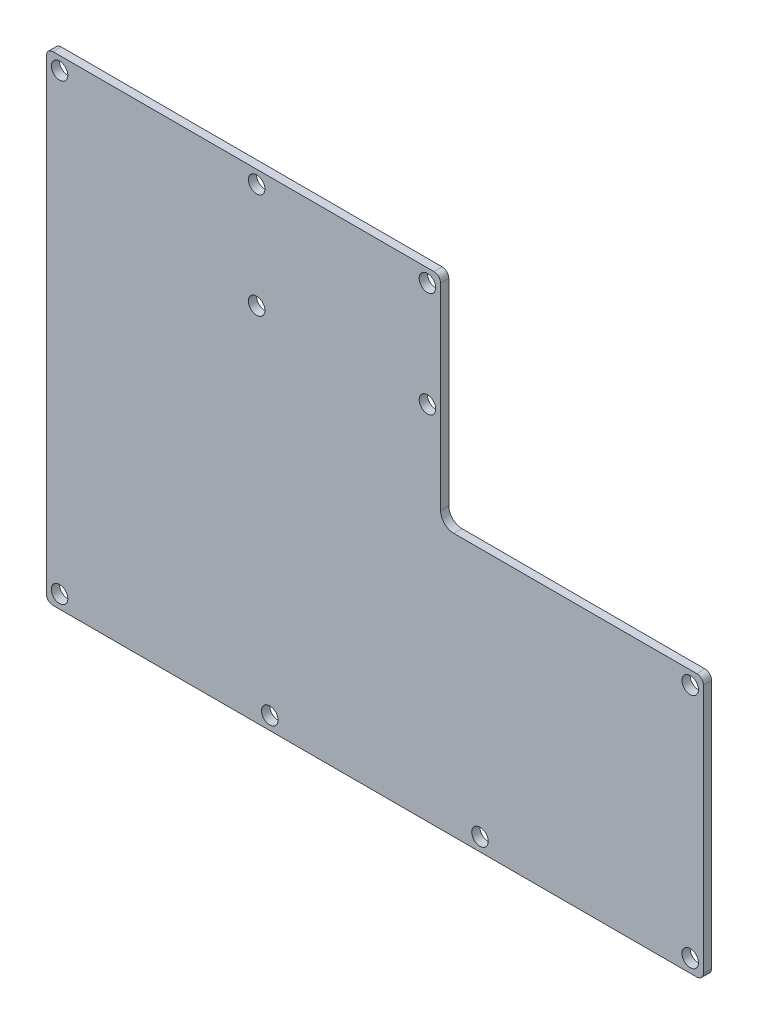
ISO-10303-21;
HEADER;
FILE_DESCRIPTION(('STEP AP214'),'2;1');
FILE_NAME('part.step','',(''),(''),'','','');
FILE_SCHEMA(('AUTOMOTIVE_DESIGN { 1 0 10303 214 1 1 1 1 }'));
ENDSEC;
DATA;
#1=APPLICATION_CONTEXT('core data for automotive mechanical design processes');
#2=APPLICATION_PROTOCOL_DEFINITION('international standard','automotive_design',2000,#1);
#3=PRODUCT_CONTEXT('',#1,'mechanical');
#4=PRODUCT('Part','Part','',(#3));
#5=PRODUCT_RELATED_PRODUCT_CATEGORY('part','',(#4));
#6=PRODUCT_DEFINITION_FORMATION('','',#4);
#7=PRODUCT_DEFINITION_CONTEXT('part definition',#1,'design');
#8=PRODUCT_DEFINITION('design','',#6,#7);
#9=PRODUCT_DEFINITION_SHAPE('','',#8);
#10=(LENGTH_UNIT() NAMED_UNIT(*) SI_UNIT(.MILLI.,.METRE.));
#11=(NAMED_UNIT(*) PLANE_ANGLE_UNIT() SI_UNIT($,.RADIAN.));
#12=(NAMED_UNIT(*) SI_UNIT($,.STERADIAN.) SOLID_ANGLE_UNIT());
#13=UNCERTAINTY_MEASURE_WITH_UNIT(LENGTH_MEASURE(1.E-05),#10,'distance_accuracy_value','');
#14=(GEOMETRIC_REPRESENTATION_CONTEXT(3) GLOBAL_UNCERTAINTY_ASSIGNED_CONTEXT((#13)) GLOBAL_UNIT_ASSIGNED_CONTEXT((#10,
#11,#12)) REPRESENTATION_CONTEXT('',''));
#15=CARTESIAN_POINT('',(0.,0.,0.));
#16=DIRECTION('',(0.,0.,1.));
#17=DIRECTION('',(1.,0.,0.));
#18=AXIS2_PLACEMENT_3D('',#15,#16,#17);
#19=CARTESIAN_POINT('',(125.73,1.27,-1.5875));
#20=DIRECTION('',(0.,0.,1.));
#21=DIRECTION('',(1.,0.,0.));
#22=AXIS2_PLACEMENT_3D('',#19,#20,#21);
#23=CYLINDRICAL_SURFACE('',#22,1.27);
#24=CARTESIAN_POINT('',(125.73,1.27,0.));
#25=DIRECTION('',(0.,0.,1.));
#26=DIRECTION('',(1.,0.,0.));
#27=AXIS2_PLACEMENT_3D('',#24,#25,#26);
#28=CIRCLE('',#27,1.27);
#29=CARTESIAN_POINT('',(125.73,0.,0.));
#30=VERTEX_POINT('',#29);
#31=CARTESIAN_POINT('',(127.,1.27,0.));
#32=VERTEX_POINT('',#31);
#33=EDGE_CURVE('E160',#30,#32,#28,.T.);
#34=ORIENTED_EDGE('',*,*,#33,.F.);
#35=DIRECTION('',(0.,0.,1.));
#36=VECTOR('',#35,1.);
#37=CARTESIAN_POINT('',(125.73,0.,-1.5875));
#38=LINE('',#37,#36);
#39=CARTESIAN_POINT('',(125.73,0.,-1.5875));
#40=VERTEX_POINT('',#39);
#41=EDGE_CURVE('E11',#40,#30,#38,.T.);
#42=ORIENTED_EDGE('',*,*,#41,.F.);
#43=CARTESIAN_POINT('',(125.73,1.27,-1.5875));
#44=DIRECTION('',(0.,0.,1.));
#45=DIRECTION('',(1.,0.,0.));
#46=AXIS2_PLACEMENT_3D('',#43,#44,#45);
#47=CIRCLE('',#46,1.27);
#48=CARTESIAN_POINT('',(127.,1.27,-1.5875));
#49=VERTEX_POINT('',#48);
#50=EDGE_CURVE('E193',#40,#49,#47,.T.);
#51=ORIENTED_EDGE('',*,*,#50,.T.);
#52=DIRECTION('',(0.,0.,1.));
#53=VECTOR('',#52,1.);
#54=CARTESIAN_POINT('',(127.,1.27,-1.5875));
#55=LINE('',#54,#53);
#56=EDGE_CURVE('E42',#49,#32,#55,.T.);
#57=ORIENTED_EDGE('',*,*,#56,.T.);
#58=EDGE_LOOP('',(#34,#42,#51,#57));
#59=FACE_BOUND('',#58,.T.);
#60=ADVANCED_FACE('F39',(#59),#23,.T.);
#61=CARTESIAN_POINT('',(1.27,0.,-1.5875));
#62=DIRECTION('',(0.,-1.,0.));
#63=DIRECTION('',(0.,0.,-1.));
#64=AXIS2_PLACEMENT_3D('',#61,#62,#63);
#65=PLANE('',#64);
#66=DIRECTION('',(1.,0.,0.));
#67=VECTOR('',#66,1.);
#68=CARTESIAN_POINT('',(1.27,0.,0.));
#69=LINE('',#68,#67);
#70=CARTESIAN_POINT('',(1.27,0.,0.));
#71=VERTEX_POINT('',#70);
#72=EDGE_CURVE('E191',#71,#30,#69,.T.);
#73=ORIENTED_EDGE('',*,*,#72,.F.);
#74=DIRECTION('',(0.,0.,1.));
#75=VECTOR('',#74,1.);
#76=CARTESIAN_POINT('',(1.27,0.,-1.5875));
#77=LINE('',#76,#75);
#78=CARTESIAN_POINT('',(1.27,0.,-1.5875));
#79=VERTEX_POINT('',#78);
#80=EDGE_CURVE('E48',#79,#71,#77,.T.);
#81=ORIENTED_EDGE('',*,*,#80,.F.);
#82=DIRECTION('',(1.,0.,0.));
#83=VECTOR('',#82,1.);
#84=CARTESIAN_POINT('',(1.27,0.,-1.5875));
#85=LINE('',#84,#83);
#86=EDGE_CURVE('E150',#79,#40,#85,.T.);
#87=ORIENTED_EDGE('',*,*,#86,.T.);
#88=ORIENTED_EDGE('',*,*,#41,.T.);
#89=EDGE_LOOP('',(#73,#81,#87,#88));
#90=FACE_BOUND('',#89,.T.);
#91=ADVANCED_FACE('F213',(#90),#65,.T.);
#92=CARTESIAN_POINT('',(1.27,1.27,-1.5875));
#93=DIRECTION('',(0.,0.,1.));
#94=DIRECTION('',(1.,0.,0.));
#95=AXIS2_PLACEMENT_3D('',#92,#93,#94);
#96=CYLINDRICAL_SURFACE('',#95,1.27);
#97=CARTESIAN_POINT('',(1.27,1.27,0.));
#98=DIRECTION('',(0.,0.,1.));
#99=DIRECTION('',(1.,0.,0.));
#100=AXIS2_PLACEMENT_3D('',#97,#98,#99);
#101=CIRCLE('',#100,1.27);
#102=CARTESIAN_POINT('',(0.,1.27,0.));
#103=VERTEX_POINT('',#102);
#104=EDGE_CURVE('E137',#103,#71,#101,.T.);
#105=ORIENTED_EDGE('',*,*,#104,.F.);
#106=DIRECTION('',(0.,0.,1.));
#107=VECTOR('',#106,1.);
#108=CARTESIAN_POINT('',(0.,1.27,-1.5875));
#109=LINE('',#108,#107);
#110=CARTESIAN_POINT('',(0.,1.27,-1.5875));
#111=VERTEX_POINT('',#110);
#112=EDGE_CURVE('E132',#111,#103,#109,.T.);
#113=ORIENTED_EDGE('',*,*,#112,.F.);
#114=CARTESIAN_POINT('',(1.27,1.27,-1.5875));
#115=DIRECTION('',(0.,0.,1.));
#116=DIRECTION('',(1.,0.,0.));
#117=AXIS2_PLACEMENT_3D('',#114,#115,#116);
#118=CIRCLE('',#117,1.27);
#119=EDGE_CURVE('E135',#111,#79,#118,.T.);
#120=ORIENTED_EDGE('',*,*,#119,.T.);
#121=ORIENTED_EDGE('',*,*,#80,.T.);
#122=EDGE_LOOP('',(#105,#113,#120,#121));
#123=FACE_BOUND('',#122,.T.);
#124=ADVANCED_FACE('F134',(#123),#96,.T.);
#125=CARTESIAN_POINT('',(0.,91.44,-1.5875));
#126=DIRECTION('',(-1.,0.,0.));
#127=DIRECTION('',(0.,0.,1.));
#128=AXIS2_PLACEMENT_3D('',#125,#126,#127);
#129=PLANE('',#128);
#130=DIRECTION('',(0.,-1.,0.));
#131=VECTOR('',#130,1.);
#132=CARTESIAN_POINT('',(0.,91.44,0.));
#133=LINE('',#132,#131);
#134=CARTESIAN_POINT('',(0.,91.44,0.));
#135=VERTEX_POINT('',#134);
#136=EDGE_CURVE('E188',#135,#103,#133,.T.);
#137=ORIENTED_EDGE('',*,*,#136,.F.);
#138=DIRECTION('',(0.,0.,1.));
#139=VECTOR('',#138,1.);
#140=CARTESIAN_POINT('',(0.,91.44,-1.5875));
#141=LINE('',#140,#139);
#142=CARTESIAN_POINT('',(0.,91.44,-1.5875));
#143=VERTEX_POINT('',#142);
#144=EDGE_CURVE('E142',#143,#135,#141,.T.);
#145=ORIENTED_EDGE('',*,*,#144,.F.);
#146=DIRECTION('',(0.,-1.,0.));
#147=VECTOR('',#146,1.);
#148=CARTESIAN_POINT('',(0.,91.44,-1.5875));
#149=LINE('',#148,#147);
#150=EDGE_CURVE('E148',#143,#111,#149,.T.);
#151=ORIENTED_EDGE('',*,*,#150,.T.);
#152=ORIENTED_EDGE('',*,*,#112,.T.);
#153=EDGE_LOOP('',(#137,#145,#151,#152));
#154=FACE_BOUND('',#153,.T.);
#155=ADVANCED_FACE('F152',(#154),#129,.T.);
#156=CARTESIAN_POINT('',(1.27,91.44,-1.5875));
#157=DIRECTION('',(0.,0.,1.));
#158=DIRECTION('',(1.,0.,0.));
#159=AXIS2_PLACEMENT_3D('',#156,#157,#158);
#160=CYLINDRICAL_SURFACE('',#159,1.27);
#161=CARTESIAN_POINT('',(1.27,91.44,0.));
#162=DIRECTION('',(0.,0.,1.));
#163=DIRECTION('',(1.,0.,0.));
#164=AXIS2_PLACEMENT_3D('',#161,#162,#163);
#165=CIRCLE('',#164,1.27);
#166=CARTESIAN_POINT('',(1.27,92.71,0.));
#167=VERTEX_POINT('',#166);
#168=EDGE_CURVE('E185',#167,#135,#165,.T.);
#169=ORIENTED_EDGE('',*,*,#168,.F.);
#170=DIRECTION('',(0.,0.,1.));
#171=VECTOR('',#170,1.);
#172=CARTESIAN_POINT('',(1.27,92.71,-1.5875));
#173=LINE('',#172,#171);
#174=CARTESIAN_POINT('',(1.27,92.71,-1.5875));
#175=VERTEX_POINT('',#174);
#176=EDGE_CURVE('E197',#175,#167,#173,.T.);
#177=ORIENTED_EDGE('',*,*,#176,.F.);
#178=CARTESIAN_POINT('',(1.27,91.44,-1.5875));
#179=DIRECTION('',(0.,0.,1.));
#180=DIRECTION('',(1.,0.,0.));
#181=AXIS2_PLACEMENT_3D('',#178,#179,#180);
#182=CIRCLE('',#181,1.27);
#183=EDGE_CURVE('E153',#175,#143,#182,.T.);
#184=ORIENTED_EDGE('',*,*,#183,.T.);
#185=ORIENTED_EDGE('',*,*,#144,.T.);
#186=EDGE_LOOP('',(#169,#177,#184,#185));
#187=FACE_BOUND('',#186,.T.);
#188=ADVANCED_FACE('F226',(#187),#160,.T.);
#189=CARTESIAN_POINT('',(1.27,92.71,-1.5875));
#190=DIRECTION('',(0.,1.,0.));
#191=DIRECTION('',(0.,0.,1.));
#192=AXIS2_PLACEMENT_3D('',#189,#190,#191);
#193=PLANE('',#192);
#194=DIRECTION('',(-1.,0.,0.));
#195=VECTOR('',#194,1.);
#196=CARTESIAN_POINT('',(1.27,92.71,0.));
#197=LINE('',#196,#195);
#198=CARTESIAN_POINT('',(74.93,92.71,0.));
#199=VERTEX_POINT('',#198);
#200=EDGE_CURVE('E182',#199,#167,#197,.T.);
#201=ORIENTED_EDGE('',*,*,#200,.F.);
#202=DIRECTION('',(0.,0.,1.));
#203=VECTOR('',#202,1.);
#204=CARTESIAN_POINT('',(74.93,92.71,-1.5875));
#205=LINE('',#204,#203);
#206=CARTESIAN_POINT('',(74.93,92.71,-1.5875));
#207=VERTEX_POINT('',#206);
#208=EDGE_CURVE('E199',#207,#199,#205,.T.);
#209=ORIENTED_EDGE('',*,*,#208,.F.);
#210=DIRECTION('',(-1.,0.,0.));
#211=VECTOR('',#210,1.);
#212=CARTESIAN_POINT('',(1.27,92.71,-1.5875));
#213=LINE('',#212,#211);
#214=EDGE_CURVE('E155',#207,#175,#213,.T.);
#215=ORIENTED_EDGE('',*,*,#214,.T.);
#216=ORIENTED_EDGE('',*,*,#176,.T.);
#217=EDGE_LOOP('',(#201,#209,#215,#216));
#218=FACE_BOUND('',#217,.T.);
#219=ADVANCED_FACE('F229',(#218),#193,.T.);
#220=CARTESIAN_POINT('',(74.93,91.44,-1.5875));
#221=DIRECTION('',(0.,0.,1.));
#222=DIRECTION('',(1.,0.,0.));
#223=AXIS2_PLACEMENT_3D('',#220,#221,#222);
#224=CYLINDRICAL_SURFACE('',#223,1.27);
#225=CARTESIAN_POINT('',(74.93,91.44,0.));
#226=DIRECTION('',(0.,0.,1.));
#227=DIRECTION('',(1.,0.,0.));
#228=AXIS2_PLACEMENT_3D('',#225,#226,#227);
#229=CIRCLE('',#228,1.27);
#230=CARTESIAN_POINT('',(76.2,91.44,0.));
#231=VERTEX_POINT('',#230);
#232=EDGE_CURVE('E179',#231,#199,#229,.T.);
#233=ORIENTED_EDGE('',*,*,#232,.F.);
#234=DIRECTION('',(0.,0.,1.));
#235=VECTOR('',#234,1.);
#236=CARTESIAN_POINT('',(76.2,91.44,-1.5875));
#237=LINE('',#236,#235);
#238=CARTESIAN_POINT('',(76.2,91.44,-1.5875));
#239=VERTEX_POINT('',#238);
#240=EDGE_CURVE('E201',#239,#231,#237,.T.);
#241=ORIENTED_EDGE('',*,*,#240,.F.);
#242=CARTESIAN_POINT('',(74.93,91.44,-1.5875));
#243=DIRECTION('',(0.,0.,1.));
#244=DIRECTION('',(1.,0.,0.));
#245=AXIS2_PLACEMENT_3D('',#242,#243,#244);
#246=CIRCLE('',#245,1.27);
#247=EDGE_CURVE('E383',#239,#207,#246,.T.);
#248=ORIENTED_EDGE('',*,*,#247,.T.);
#249=ORIENTED_EDGE('',*,*,#208,.T.);
#250=EDGE_LOOP('',(#233,#241,#248,#249));
#251=FACE_BOUND('',#250,.T.);
#252=ADVANCED_FACE('F233',(#251),#224,.T.);
#253=CARTESIAN_POINT('',(76.2,91.44,-1.5875));
#254=DIRECTION('',(1.,0.,0.));
#255=DIRECTION('',(0.,0.,-1.));
#256=AXIS2_PLACEMENT_3D('',#253,#254,#255);
#257=PLANE('',#256);
#258=DIRECTION('',(0.,1.,0.));
#259=VECTOR('',#258,1.);
#260=CARTESIAN_POINT('',(76.2,91.44,0.));
#261=LINE('',#260,#259);
#262=CARTESIAN_POINT('',(76.2,53.34,0.));
#263=VERTEX_POINT('',#262);
#264=EDGE_CURVE('E176',#263,#231,#261,.T.);
#265=ORIENTED_EDGE('',*,*,#264,.F.);
#266=DIRECTION('',(0.,0.,1.));
#267=VECTOR('',#266,1.);
#268=CARTESIAN_POINT('',(76.2,53.34,-1.5875));
#269=LINE('',#268,#267);
#270=CARTESIAN_POINT('',(76.2,53.34,-1.5875));
#271=VERTEX_POINT('',#270);
#272=EDGE_CURVE('E203',#271,#263,#269,.T.);
#273=ORIENTED_EDGE('',*,*,#272,.F.);
#274=DIRECTION('',(0.,1.,0.));
#275=VECTOR('',#274,1.);
#276=CARTESIAN_POINT('',(76.2,91.44,-1.5875));
#277=LINE('',#276,#275);
#278=EDGE_CURVE('E380',#271,#239,#277,.T.);
#279=ORIENTED_EDGE('',*,*,#278,.T.);
#280=ORIENTED_EDGE('',*,*,#240,.T.);
#281=EDGE_LOOP('',(#265,#273,#279,#280));
#282=FACE_BOUND('',#281,.T.);
#283=ADVANCED_FACE('F237',(#282),#257,.T.);
#284=CARTESIAN_POINT('',(78.74,53.34,-1.5875));
#285=DIRECTION('',(0.,0.,1.));
#286=DIRECTION('',(1.,0.,0.));
#287=AXIS2_PLACEMENT_3D('',#284,#285,#286);
#288=CYLINDRICAL_SURFACE('',#287,2.54);
#289=CARTESIAN_POINT('',(78.74,53.34,0.));
#290=DIRECTION('',(0.,0.,-1.));
#291=DIRECTION('',(1.,0.,0.));
#292=AXIS2_PLACEMENT_3D('',#289,#290,#291);
#293=CIRCLE('',#292,2.54);
#294=CARTESIAN_POINT('',(78.74,50.8,0.));
#295=VERTEX_POINT('',#294);
#296=EDGE_CURVE('E173',#295,#263,#293,.T.);
#297=ORIENTED_EDGE('',*,*,#296,.F.);
#298=DIRECTION('',(0.,0.,1.));
#299=VECTOR('',#298,1.);
#300=CARTESIAN_POINT('',(78.74,50.8,-1.5875));
#301=LINE('',#300,#299);
#302=CARTESIAN_POINT('',(78.74,50.8,-1.5875));
#303=VERTEX_POINT('',#302);
#304=EDGE_CURVE('E205',#303,#295,#301,.T.);
#305=ORIENTED_EDGE('',*,*,#304,.F.);
#306=CARTESIAN_POINT('',(78.74,53.34,-1.5875));
#307=DIRECTION('',(0.,0.,-1.));
#308=DIRECTION('',(1.,0.,0.));
#309=AXIS2_PLACEMENT_3D('',#306,#307,#308);
#310=CIRCLE('',#309,2.54);
#311=EDGE_CURVE('E377',#303,#271,#310,.T.);
#312=ORIENTED_EDGE('',*,*,#311,.T.);
#313=ORIENTED_EDGE('',*,*,#272,.T.);
#314=EDGE_LOOP('',(#297,#305,#312,#313));
#315=FACE_BOUND('',#314,.T.);
#316=ADVANCED_FACE('F241',(#315),#288,.F.);
#317=CARTESIAN_POINT('',(78.74,50.8,-1.5875));
#318=DIRECTION('',(0.,1.,0.));
#319=DIRECTION('',(0.,0.,1.));
#320=AXIS2_PLACEMENT_3D('',#317,#318,#319);
#321=PLANE('',#320);
#322=DIRECTION('',(-1.,0.,0.));
#323=VECTOR('',#322,1.);
#324=CARTESIAN_POINT('',(78.74,50.8,0.));
#325=LINE('',#324,#323);
#326=CARTESIAN_POINT('',(125.73,50.8,0.));
#327=VERTEX_POINT('',#326);
#328=EDGE_CURVE('E170',#327,#295,#325,.T.);
#329=ORIENTED_EDGE('',*,*,#328,.F.);
#330=DIRECTION('',(0.,0.,1.));
#331=VECTOR('',#330,1.);
#332=CARTESIAN_POINT('',(125.73,50.8,-1.5875));
#333=LINE('',#332,#331);
#334=CARTESIAN_POINT('',(125.73,50.8,-1.5875));
#335=VERTEX_POINT('',#334);
#336=EDGE_CURVE('E207',#335,#327,#333,.T.);
#337=ORIENTED_EDGE('',*,*,#336,.F.);
#338=DIRECTION('',(-1.,0.,0.));
#339=VECTOR('',#338,1.);
#340=CARTESIAN_POINT('',(78.74,50.8,-1.5875));
#341=LINE('',#340,#339);
#342=EDGE_CURVE('E374',#335,#303,#341,.T.);
#343=ORIENTED_EDGE('',*,*,#342,.T.);
#344=ORIENTED_EDGE('',*,*,#304,.T.);
#345=EDGE_LOOP('',(#329,#337,#343,#344));
#346=FACE_BOUND('',#345,.T.);
#347=ADVANCED_FACE('F245',(#346),#321,.T.);
#348=CARTESIAN_POINT('',(125.73,49.53,-1.5875));
#349=DIRECTION('',(0.,0.,1.));
#350=DIRECTION('',(1.,0.,0.));
#351=AXIS2_PLACEMENT_3D('',#348,#349,#350);
#352=CYLINDRICAL_SURFACE('',#351,1.26999999999999);
#353=CARTESIAN_POINT('',(125.73,49.53,0.));
#354=DIRECTION('',(0.,0.,1.));
#355=DIRECTION('',(1.,0.,0.));
#356=AXIS2_PLACEMENT_3D('',#353,#354,#355);
#357=CIRCLE('',#356,1.26999999999999);
#358=CARTESIAN_POINT('',(127.,49.53,0.));
#359=VERTEX_POINT('',#358);
#360=EDGE_CURVE('E167',#359,#327,#357,.T.);
#361=ORIENTED_EDGE('',*,*,#360,.F.);
#362=DIRECTION('',(0.,0.,1.));
#363=VECTOR('',#362,1.);
#364=CARTESIAN_POINT('',(127.,49.53,-1.5875));
#365=LINE('',#364,#363);
#366=CARTESIAN_POINT('',(127.,49.53,-1.5875));
#367=VERTEX_POINT('',#366);
#368=EDGE_CURVE('E208',#367,#359,#365,.T.);
#369=ORIENTED_EDGE('',*,*,#368,.F.);
#370=CARTESIAN_POINT('',(125.73,49.53,-1.5875));
#371=DIRECTION('',(0.,0.,1.));
#372=DIRECTION('',(1.,0.,0.));
#373=AXIS2_PLACEMENT_3D('',#370,#371,#372);
#374=CIRCLE('',#373,1.26999999999999);
#375=EDGE_CURVE('E371',#367,#335,#374,.T.);
#376=ORIENTED_EDGE('',*,*,#375,.T.);
#377=ORIENTED_EDGE('',*,*,#336,.T.);
#378=EDGE_LOOP('',(#361,#369,#376,#377));
#379=FACE_BOUND('',#378,.T.);
#380=ADVANCED_FACE('F249',(#379),#352,.T.);
#381=CARTESIAN_POINT('',(127.,49.53,-1.5875));
#382=DIRECTION('',(1.,0.,0.));
#383=DIRECTION('',(0.,0.,-1.));
#384=AXIS2_PLACEMENT_3D('',#381,#382,#383);
#385=PLANE('',#384);
#386=DIRECTION('',(0.,1.,0.));
#387=VECTOR('',#386,1.);
#388=CARTESIAN_POINT('',(127.,49.53,0.));
#389=LINE('',#388,#387);
#390=EDGE_CURVE('E163',#32,#359,#389,.T.);
#391=ORIENTED_EDGE('',*,*,#390,.F.);
#392=ORIENTED_EDGE('',*,*,#56,.F.);
#393=DIRECTION('',(0.,1.,0.));
#394=VECTOR('',#393,1.);
#395=CARTESIAN_POINT('',(127.,49.53,-1.5875));
#396=LINE('',#395,#394);
#397=EDGE_CURVE('E369',#49,#367,#396,.T.);
#398=ORIENTED_EDGE('',*,*,#397,.T.);
#399=ORIENTED_EDGE('',*,*,#368,.T.);
#400=EDGE_LOOP('',(#391,#392,#398,#399));
#401=FACE_BOUND('',#400,.T.);
#402=ADVANCED_FACE('F210',(#401),#385,.T.);
#403=CARTESIAN_POINT('',(125.73,1.27,-1.5875));
#404=DIRECTION('',(0.,0.,1.));
#405=DIRECTION('',(1.,0.,0.));
#406=AXIS2_PLACEMENT_3D('',#403,#404,#405);
#407=PLANE('',#406);
#408=CARTESIAN_POINT('',(73.66,90.17,-1.5875));
#409=DIRECTION('',(0.,0.,1.));
#410=DIRECTION('',(1.,0.,0.));
#411=AXIS2_PLACEMENT_3D('',#408,#409,#410);
#412=CIRCLE('',#411,1.6);
#413=CARTESIAN_POINT('',(75.26,90.17,-1.5875));
#414=VERTEX_POINT('',#413);
#415=EDGE_CURVE('E308',#414,#414,#412,.T.);
#416=ORIENTED_EDGE('',*,*,#415,.T.);
#417=EDGE_LOOP('',(#416));
#418=FACE_BOUND('',#417,.T.);
#419=CARTESIAN_POINT('',(40.64,90.17,-1.5875));
#420=DIRECTION('',(0.,0.,1.));
#421=DIRECTION('',(1.,0.,0.));
#422=AXIS2_PLACEMENT_3D('',#419,#420,#421);
#423=CIRCLE('',#422,1.6);
#424=CARTESIAN_POINT('',(42.24,90.17,-1.5875));
#425=VERTEX_POINT('',#424);
#426=EDGE_CURVE('E316',#425,#425,#423,.T.);
#427=ORIENTED_EDGE('',*,*,#426,.T.);
#428=EDGE_LOOP('',(#427));
#429=FACE_BOUND('',#428,.T.);
#430=CARTESIAN_POINT('',(40.64,69.85,-1.5875));
#431=DIRECTION('',(0.,0.,1.));
#432=DIRECTION('',(1.,0.,0.));
#433=AXIS2_PLACEMENT_3D('',#430,#431,#432);
#434=CIRCLE('',#433,1.6);
#435=CARTESIAN_POINT('',(42.24,69.85,-1.5875));
#436=VERTEX_POINT('',#435);
#437=EDGE_CURVE('E322',#436,#436,#434,.T.);
#438=ORIENTED_EDGE('',*,*,#437,.T.);
#439=EDGE_LOOP('',(#438));
#440=FACE_BOUND('',#439,.T.);
#441=CARTESIAN_POINT('',(73.66,69.85,-1.5875));
#442=DIRECTION('',(0.,0.,1.));
#443=DIRECTION('',(1.,0.,0.));
#444=AXIS2_PLACEMENT_3D('',#441,#442,#443);
#445=CIRCLE('',#444,1.6);
#446=CARTESIAN_POINT('',(75.26,69.85,-1.5875));
#447=VERTEX_POINT('',#446);
#448=EDGE_CURVE('E328',#447,#447,#445,.T.);
#449=ORIENTED_EDGE('',*,*,#448,.T.);
#450=EDGE_LOOP('',(#449));
#451=FACE_BOUND('',#450,.T.);
#452=CARTESIAN_POINT('',(124.46,48.26,-1.5875));
#453=DIRECTION('',(0.,0.,1.));
#454=DIRECTION('',(1.,0.,0.));
#455=AXIS2_PLACEMENT_3D('',#452,#453,#454);
#456=CIRCLE('',#455,1.6);
#457=CARTESIAN_POINT('',(126.06,48.26,-1.5875));
#458=VERTEX_POINT('',#457);
#459=EDGE_CURVE('E334',#458,#458,#456,.T.);
#460=ORIENTED_EDGE('',*,*,#459,.T.);
#461=EDGE_LOOP('',(#460));
#462=FACE_BOUND('',#461,.T.);
#463=CARTESIAN_POINT('',(83.82,2.54,-1.5875));
#464=DIRECTION('',(0.,0.,1.));
#465=DIRECTION('',(1.,0.,0.));
#466=AXIS2_PLACEMENT_3D('',#463,#464,#465);
#467=CIRCLE('',#466,1.6);
#468=CARTESIAN_POINT('',(85.42,2.54,-1.5875));
#469=VERTEX_POINT('',#468);
#470=EDGE_CURVE('E340',#469,#469,#467,.T.);
#471=ORIENTED_EDGE('',*,*,#470,.T.);
#472=EDGE_LOOP('',(#471));
#473=FACE_BOUND('',#472,.T.);
#474=CARTESIAN_POINT('',(43.18,2.54,-1.5875));
#475=DIRECTION('',(0.,0.,1.));
#476=DIRECTION('',(1.,0.,0.));
#477=AXIS2_PLACEMENT_3D('',#474,#475,#476);
#478=CIRCLE('',#477,1.6);
#479=CARTESIAN_POINT('',(44.78,2.54,-1.5875));
#480=VERTEX_POINT('',#479);
#481=EDGE_CURVE('E346',#480,#480,#478,.T.);
#482=ORIENTED_EDGE('',*,*,#481,.T.);
#483=EDGE_LOOP('',(#482));
#484=FACE_BOUND('',#483,.T.);
#485=CARTESIAN_POINT('',(2.54,90.17,-1.5875));
#486=DIRECTION('',(0.,0.,1.));
#487=DIRECTION('',(1.,0.,0.));
#488=AXIS2_PLACEMENT_3D('',#485,#486,#487);
#489=CIRCLE('',#488,1.6);
#490=CARTESIAN_POINT('',(4.14,90.17,-1.5875));
#491=VERTEX_POINT('',#490);
#492=EDGE_CURVE('E352',#491,#491,#489,.T.);
#493=ORIENTED_EDGE('',*,*,#492,.T.);
#494=EDGE_LOOP('',(#493));
#495=FACE_BOUND('',#494,.T.);
#496=CARTESIAN_POINT('',(124.46,2.54,-1.5875));
#497=DIRECTION('',(0.,0.,1.));
#498=DIRECTION('',(1.,0.,0.));
#499=AXIS2_PLACEMENT_3D('',#496,#497,#498);
#500=CIRCLE('',#499,1.6);
#501=CARTESIAN_POINT('',(126.06,2.54,-1.5875));
#502=VERTEX_POINT('',#501);
#503=EDGE_CURVE('E358',#502,#502,#500,.T.);
#504=ORIENTED_EDGE('',*,*,#503,.T.);
#505=EDGE_LOOP('',(#504));
#506=FACE_BOUND('',#505,.T.);
#507=CARTESIAN_POINT('',(2.54,2.54,-1.5875));
#508=DIRECTION('',(0.,0.,1.));
#509=DIRECTION('',(1.,0.,0.));
#510=AXIS2_PLACEMENT_3D('',#507,#508,#509);
#511=CIRCLE('',#510,1.6);
#512=CARTESIAN_POINT('',(4.14,2.54,-1.5875));
#513=VERTEX_POINT('',#512);
#514=EDGE_CURVE('E164',#513,#513,#511,.T.);
#515=ORIENTED_EDGE('',*,*,#514,.T.);
#516=EDGE_LOOP('',(#515));
#517=FACE_BOUND('',#516,.T.);
#518=ORIENTED_EDGE('',*,*,#50,.F.);
#519=ORIENTED_EDGE('',*,*,#86,.F.);
#520=ORIENTED_EDGE('',*,*,#119,.F.);
#521=ORIENTED_EDGE('',*,*,#150,.F.);
#522=ORIENTED_EDGE('',*,*,#183,.F.);
#523=ORIENTED_EDGE('',*,*,#214,.F.);
#524=ORIENTED_EDGE('',*,*,#247,.F.);
#525=ORIENTED_EDGE('',*,*,#278,.F.);
#526=ORIENTED_EDGE('',*,*,#311,.F.);
#527=ORIENTED_EDGE('',*,*,#342,.F.);
#528=ORIENTED_EDGE('',*,*,#375,.F.);
#529=ORIENTED_EDGE('',*,*,#397,.F.);
#530=EDGE_LOOP('',(#518,#519,#520,#521,#522,#523,#524,#525,#526,#527,#528,#529));
#531=FACE_BOUND('',#530,.T.);
#532=ADVANCED_FACE('F146',(#418,#429,#440,#451,#462,#473,#484,#495,#506,#517,#531),#407,.F.);
#533=CARTESIAN_POINT('',(125.73,1.27,0.));
#534=DIRECTION('',(0.,0.,1.));
#535=DIRECTION('',(1.,0.,0.));
#536=AXIS2_PLACEMENT_3D('',#533,#534,#535);
#537=PLANE('',#536);
#538=CARTESIAN_POINT('',(73.66,90.17,0.));
#539=DIRECTION('',(0.,0.,1.));
#540=DIRECTION('',(1.,0.,0.));
#541=AXIS2_PLACEMENT_3D('',#538,#539,#540);
#542=CIRCLE('',#541,1.6);
#543=CARTESIAN_POINT('',(75.26,90.17,0.));
#544=VERTEX_POINT('',#543);
#545=EDGE_CURVE('E311',#544,#544,#542,.T.);
#546=ORIENTED_EDGE('',*,*,#545,.F.);
#547=EDGE_LOOP('',(#546));
#548=FACE_BOUND('',#547,.T.);
#549=CARTESIAN_POINT('',(40.64,90.17,0.));
#550=DIRECTION('',(0.,0.,1.));
#551=DIRECTION('',(1.,0.,0.));
#552=AXIS2_PLACEMENT_3D('',#549,#550,#551);
#553=CIRCLE('',#552,1.6);
#554=CARTESIAN_POINT('',(42.24,90.17,0.));
#555=VERTEX_POINT('',#554);
#556=EDGE_CURVE('E313',#555,#555,#553,.T.);
#557=ORIENTED_EDGE('',*,*,#556,.F.);
#558=EDGE_LOOP('',(#557));
#559=FACE_BOUND('',#558,.T.);
#560=CARTESIAN_POINT('',(40.64,69.85,0.));
#561=DIRECTION('',(0.,0.,1.));
#562=DIRECTION('',(1.,0.,0.));
#563=AXIS2_PLACEMENT_3D('',#560,#561,#562);
#564=CIRCLE('',#563,1.6);
#565=CARTESIAN_POINT('',(42.24,69.85,0.));
#566=VERTEX_POINT('',#565);
#567=EDGE_CURVE('E319',#566,#566,#564,.T.);
#568=ORIENTED_EDGE('',*,*,#567,.F.);
#569=EDGE_LOOP('',(#568));
#570=FACE_BOUND('',#569,.T.);
#571=CARTESIAN_POINT('',(73.66,69.85,0.));
#572=DIRECTION('',(0.,0.,1.));
#573=DIRECTION('',(1.,0.,0.));
#574=AXIS2_PLACEMENT_3D('',#571,#572,#573);
#575=CIRCLE('',#574,1.6);
#576=CARTESIAN_POINT('',(75.26,69.85,0.));
#577=VERTEX_POINT('',#576);
#578=EDGE_CURVE('E325',#577,#577,#575,.T.);
#579=ORIENTED_EDGE('',*,*,#578,.F.);
#580=EDGE_LOOP('',(#579));
#581=FACE_BOUND('',#580,.T.);
#582=CARTESIAN_POINT('',(124.46,48.26,0.));
#583=DIRECTION('',(0.,0.,1.));
#584=DIRECTION('',(1.,0.,0.));
#585=AXIS2_PLACEMENT_3D('',#582,#583,#584);
#586=CIRCLE('',#585,1.6);
#587=CARTESIAN_POINT('',(126.06,48.26,0.));
#588=VERTEX_POINT('',#587);
#589=EDGE_CURVE('E331',#588,#588,#586,.T.);
#590=ORIENTED_EDGE('',*,*,#589,.F.);
#591=EDGE_LOOP('',(#590));
#592=FACE_BOUND('',#591,.T.);
#593=CARTESIAN_POINT('',(83.82,2.54,0.));
#594=DIRECTION('',(0.,0.,1.));
#595=DIRECTION('',(1.,0.,0.));
#596=AXIS2_PLACEMENT_3D('',#593,#594,#595);
#597=CIRCLE('',#596,1.6);
#598=CARTESIAN_POINT('',(85.42,2.54,0.));
#599=VERTEX_POINT('',#598);
#600=EDGE_CURVE('E337',#599,#599,#597,.T.);
#601=ORIENTED_EDGE('',*,*,#600,.F.);
#602=EDGE_LOOP('',(#601));
#603=FACE_BOUND('',#602,.T.);
#604=CARTESIAN_POINT('',(43.18,2.54,0.));
#605=DIRECTION('',(0.,0.,1.));
#606=DIRECTION('',(1.,0.,0.));
#607=AXIS2_PLACEMENT_3D('',#604,#605,#606);
#608=CIRCLE('',#607,1.6);
#609=CARTESIAN_POINT('',(44.78,2.54,0.));
#610=VERTEX_POINT('',#609);
#611=EDGE_CURVE('E343',#610,#610,#608,.T.);
#612=ORIENTED_EDGE('',*,*,#611,.F.);
#613=EDGE_LOOP('',(#612));
#614=FACE_BOUND('',#613,.T.);
#615=CARTESIAN_POINT('',(2.54,90.17,0.));
#616=DIRECTION('',(0.,0.,1.));
#617=DIRECTION('',(1.,0.,0.));
#618=AXIS2_PLACEMENT_3D('',#615,#616,#617);
#619=CIRCLE('',#618,1.6);
#620=CARTESIAN_POINT('',(4.14,90.17,0.));
#621=VERTEX_POINT('',#620);
#622=EDGE_CURVE('E349',#621,#621,#619,.T.);
#623=ORIENTED_EDGE('',*,*,#622,.F.);
#624=EDGE_LOOP('',(#623));
#625=FACE_BOUND('',#624,.T.);
#626=CARTESIAN_POINT('',(124.46,2.54,0.));
#627=DIRECTION('',(0.,0.,1.));
#628=DIRECTION('',(1.,0.,0.));
#629=AXIS2_PLACEMENT_3D('',#626,#627,#628);
#630=CIRCLE('',#629,1.6);
#631=CARTESIAN_POINT('',(126.06,2.54,0.));
#632=VERTEX_POINT('',#631);
#633=EDGE_CURVE('E355',#632,#632,#630,.T.);
#634=ORIENTED_EDGE('',*,*,#633,.F.);
#635=EDGE_LOOP('',(#634));
#636=FACE_BOUND('',#635,.T.);
#637=CARTESIAN_POINT('',(2.54,2.54,0.));
#638=DIRECTION('',(0.,0.,1.));
#639=DIRECTION('',(1.,0.,0.));
#640=AXIS2_PLACEMENT_3D('',#637,#638,#639);
#641=CIRCLE('',#640,1.6);
#642=CARTESIAN_POINT('',(4.14,2.54,0.));
#643=VERTEX_POINT('',#642);
#644=EDGE_CURVE('E361',#643,#643,#641,.T.);
#645=ORIENTED_EDGE('',*,*,#644,.F.);
#646=EDGE_LOOP('',(#645));
#647=FACE_BOUND('',#646,.T.);
#648=ORIENTED_EDGE('',*,*,#33,.T.);
#649=ORIENTED_EDGE('',*,*,#390,.T.);
#650=ORIENTED_EDGE('',*,*,#360,.T.);
#651=ORIENTED_EDGE('',*,*,#328,.T.);
#652=ORIENTED_EDGE('',*,*,#296,.T.);
#653=ORIENTED_EDGE('',*,*,#264,.T.);
#654=ORIENTED_EDGE('',*,*,#232,.T.);
#655=ORIENTED_EDGE('',*,*,#200,.T.);
#656=ORIENTED_EDGE('',*,*,#168,.T.);
#657=ORIENTED_EDGE('',*,*,#136,.T.);
#658=ORIENTED_EDGE('',*,*,#104,.T.);
#659=ORIENTED_EDGE('',*,*,#72,.T.);
#660=EDGE_LOOP('',(#648,#649,#650,#651,#652,#653,#654,#655,#656,#657,#658,#659));
#661=FACE_BOUND('',#660,.T.);
#662=ADVANCED_FACE('F212',(#548,#559,#570,#581,#592,#603,#614,#625,#636,#647,#661),#537,.T.);
#663=CARTESIAN_POINT('',(2.54,2.54,-1.5875));
#664=DIRECTION('',(0.,0.,1.));
#665=DIRECTION('',(1.,0.,0.));
#666=AXIS2_PLACEMENT_3D('',#663,#664,#665);
#667=CYLINDRICAL_SURFACE('',#666,1.6);
#668=ORIENTED_EDGE('',*,*,#514,.F.);
#669=EDGE_LOOP('',(#668));
#670=FACE_BOUND('',#669,.T.);
#671=ORIENTED_EDGE('',*,*,#644,.T.);
#672=EDGE_LOOP('',(#671));
#673=FACE_BOUND('',#672,.T.);
#674=ADVANCED_FACE('F261',(#670,#673),#667,.F.);
#675=CARTESIAN_POINT('',(124.46,2.54,-1.5875));
#676=DIRECTION('',(0.,0.,1.));
#677=DIRECTION('',(1.,0.,0.));
#678=AXIS2_PLACEMENT_3D('',#675,#676,#677);
#679=CYLINDRICAL_SURFACE('',#678,1.6);
#680=ORIENTED_EDGE('',*,*,#503,.F.);
#681=EDGE_LOOP('',(#680));
#682=FACE_BOUND('',#681,.T.);
#683=ORIENTED_EDGE('',*,*,#633,.T.);
#684=EDGE_LOOP('',(#683));
#685=FACE_BOUND('',#684,.T.);
#686=ADVANCED_FACE('F268',(#682,#685),#679,.F.);
#687=CARTESIAN_POINT('',(2.54,90.17,-1.5875));
#688=DIRECTION('',(0.,0.,1.));
#689=DIRECTION('',(1.,0.,0.));
#690=AXIS2_PLACEMENT_3D('',#687,#688,#689);
#691=CYLINDRICAL_SURFACE('',#690,1.6);
#692=ORIENTED_EDGE('',*,*,#492,.F.);
#693=EDGE_LOOP('',(#692));
#694=FACE_BOUND('',#693,.T.);
#695=ORIENTED_EDGE('',*,*,#622,.T.);
#696=EDGE_LOOP('',(#695));
#697=FACE_BOUND('',#696,.T.);
#698=ADVANCED_FACE('F272',(#694,#697),#691,.F.);
#699=CARTESIAN_POINT('',(43.18,2.54,-1.5875));
#700=DIRECTION('',(0.,0.,1.));
#701=DIRECTION('',(1.,0.,0.));
#702=AXIS2_PLACEMENT_3D('',#699,#700,#701);
#703=CYLINDRICAL_SURFACE('',#702,1.6);
#704=ORIENTED_EDGE('',*,*,#481,.F.);
#705=EDGE_LOOP('',(#704));
#706=FACE_BOUND('',#705,.T.);
#707=ORIENTED_EDGE('',*,*,#611,.T.);
#708=EDGE_LOOP('',(#707));
#709=FACE_BOUND('',#708,.T.);
#710=ADVANCED_FACE('F276',(#706,#709),#703,.F.);
#711=CARTESIAN_POINT('',(83.82,2.54,-1.5875));
#712=DIRECTION('',(0.,0.,1.));
#713=DIRECTION('',(1.,0.,0.));
#714=AXIS2_PLACEMENT_3D('',#711,#712,#713);
#715=CYLINDRICAL_SURFACE('',#714,1.6);
#716=ORIENTED_EDGE('',*,*,#470,.F.);
#717=EDGE_LOOP('',(#716));
#718=FACE_BOUND('',#717,.T.);
#719=ORIENTED_EDGE('',*,*,#600,.T.);
#720=EDGE_LOOP('',(#719));
#721=FACE_BOUND('',#720,.T.);
#722=ADVANCED_FACE('F280',(#718,#721),#715,.F.);
#723=CARTESIAN_POINT('',(124.46,48.26,-1.5875));
#724=DIRECTION('',(0.,0.,1.));
#725=DIRECTION('',(1.,0.,0.));
#726=AXIS2_PLACEMENT_3D('',#723,#724,#725);
#727=CYLINDRICAL_SURFACE('',#726,1.6);
#728=ORIENTED_EDGE('',*,*,#459,.F.);
#729=EDGE_LOOP('',(#728));
#730=FACE_BOUND('',#729,.T.);
#731=ORIENTED_EDGE('',*,*,#589,.T.);
#732=EDGE_LOOP('',(#731));
#733=FACE_BOUND('',#732,.T.);
#734=ADVANCED_FACE('F284',(#730,#733),#727,.F.);
#735=CARTESIAN_POINT('',(73.66,69.85,-1.5875));
#736=DIRECTION('',(0.,0.,1.));
#737=DIRECTION('',(1.,0.,0.));
#738=AXIS2_PLACEMENT_3D('',#735,#736,#737);
#739=CYLINDRICAL_SURFACE('',#738,1.6);
#740=ORIENTED_EDGE('',*,*,#448,.F.);
#741=EDGE_LOOP('',(#740));
#742=FACE_BOUND('',#741,.T.);
#743=ORIENTED_EDGE('',*,*,#578,.T.);
#744=EDGE_LOOP('',(#743));
#745=FACE_BOUND('',#744,.T.);
#746=ADVANCED_FACE('F288',(#742,#745),#739,.F.);
#747=CARTESIAN_POINT('',(40.64,69.85,-1.5875));
#748=DIRECTION('',(0.,0.,1.));
#749=DIRECTION('',(1.,0.,0.));
#750=AXIS2_PLACEMENT_3D('',#747,#748,#749);
#751=CYLINDRICAL_SURFACE('',#750,1.6);
#752=ORIENTED_EDGE('',*,*,#437,.F.);
#753=EDGE_LOOP('',(#752));
#754=FACE_BOUND('',#753,.T.);
#755=ORIENTED_EDGE('',*,*,#567,.T.);
#756=EDGE_LOOP('',(#755));
#757=FACE_BOUND('',#756,.T.);
#758=ADVANCED_FACE('F292',(#754,#757),#751,.F.);
#759=CARTESIAN_POINT('',(40.64,90.17,-1.5875));
#760=DIRECTION('',(0.,0.,1.));
#761=DIRECTION('',(1.,0.,0.));
#762=AXIS2_PLACEMENT_3D('',#759,#760,#761);
#763=CYLINDRICAL_SURFACE('',#762,1.6);
#764=ORIENTED_EDGE('',*,*,#426,.F.);
#765=EDGE_LOOP('',(#764));
#766=FACE_BOUND('',#765,.T.);
#767=ORIENTED_EDGE('',*,*,#556,.T.);
#768=EDGE_LOOP('',(#767));
#769=FACE_BOUND('',#768,.T.);
#770=ADVANCED_FACE('F296',(#766,#769),#763,.F.);
#771=CARTESIAN_POINT('',(73.66,90.17,-1.5875));
#772=DIRECTION('',(0.,0.,1.));
#773=DIRECTION('',(1.,0.,0.));
#774=AXIS2_PLACEMENT_3D('',#771,#772,#773);
#775=CYLINDRICAL_SURFACE('',#774,1.6);
#776=ORIENTED_EDGE('',*,*,#415,.F.);
#777=EDGE_LOOP('',(#776));
#778=FACE_BOUND('',#777,.T.);
#779=ORIENTED_EDGE('',*,*,#545,.T.);
#780=EDGE_LOOP('',(#779));
#781=FACE_BOUND('',#780,.T.);
#782=ADVANCED_FACE('F300',(#778,#781),#775,.F.);
#783=CLOSED_SHELL('',(#60,#91,#124,#155,#188,#219,#252,#283,#316,#347,#380,#402,#532,#662,#674,
#686,#698,#710,#722,#734,#746,#758,#770,#782));
#784=MANIFOLD_SOLID_BREP('B2',#783);
#785=ADVANCED_BREP_SHAPE_REPRESENTATION('',(#18,#784),#14);
#786=SHAPE_DEFINITION_REPRESENTATION(#9,#785);
ENDSEC;
END-ISO-10303-21;
